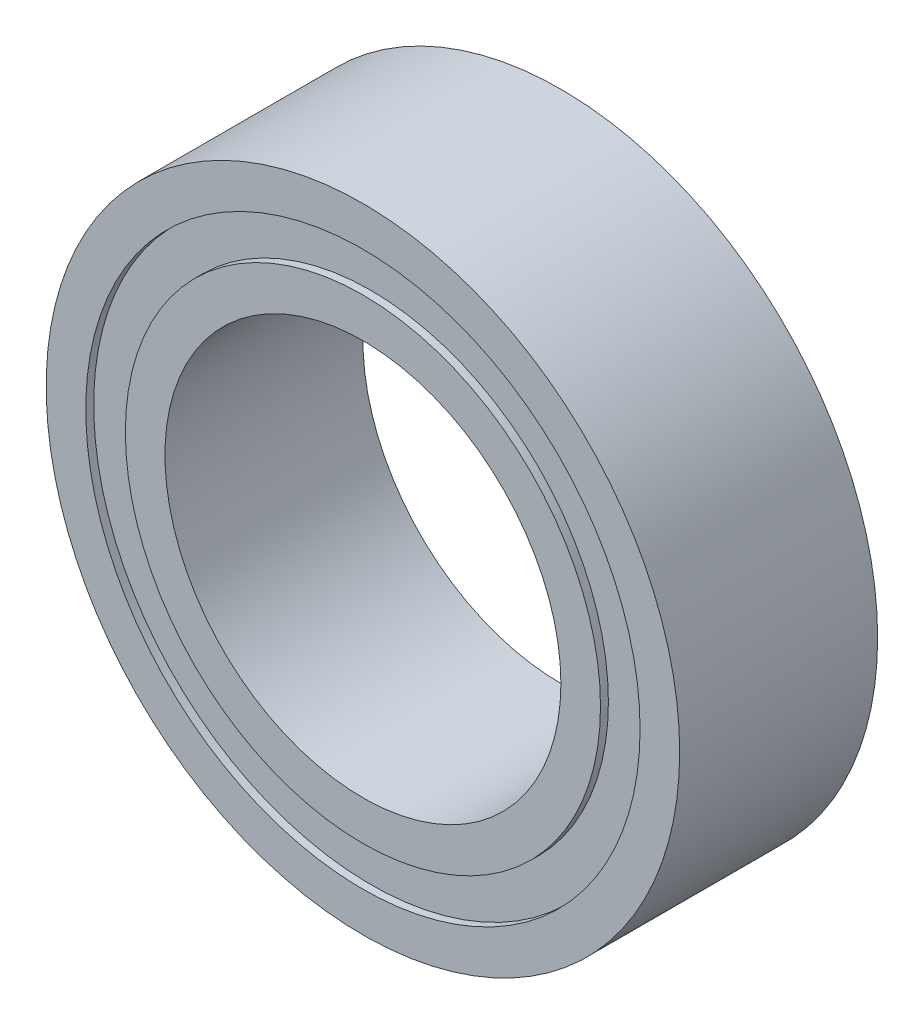
ISO-10303-21;
HEADER;
FILE_DESCRIPTION(('STEP AP214'),'2;1');
FILE_NAME('part.step','',(''),(''),'','','');
FILE_SCHEMA(('AUTOMOTIVE_DESIGN { 1 0 10303 214 1 1 1 1 }'));
ENDSEC;
DATA;
#1=APPLICATION_CONTEXT('core data for automotive mechanical design processes');
#2=APPLICATION_PROTOCOL_DEFINITION('international standard','automotive_design',2000,#1);
#3=PRODUCT_CONTEXT('',#1,'mechanical');
#4=PRODUCT('Part','Part','',(#3));
#5=PRODUCT_RELATED_PRODUCT_CATEGORY('part','',(#4));
#6=PRODUCT_DEFINITION_FORMATION('','',#4);
#7=PRODUCT_DEFINITION_CONTEXT('part definition',#1,'design');
#8=PRODUCT_DEFINITION('design','',#6,#7);
#9=PRODUCT_DEFINITION_SHAPE('','',#8);
#10=(LENGTH_UNIT() NAMED_UNIT(*) SI_UNIT(.MILLI.,.METRE.));
#11=(NAMED_UNIT(*) PLANE_ANGLE_UNIT() SI_UNIT($,.RADIAN.));
#12=(NAMED_UNIT(*) SI_UNIT($,.STERADIAN.) SOLID_ANGLE_UNIT());
#13=UNCERTAINTY_MEASURE_WITH_UNIT(LENGTH_MEASURE(1.E-05),#10,'distance_accuracy_value','');
#14=(GEOMETRIC_REPRESENTATION_CONTEXT(3) GLOBAL_UNCERTAINTY_ASSIGNED_CONTEXT((#13)) GLOBAL_UNIT_ASSIGNED_CONTEXT((#10,
#11,#12)) REPRESENTATION_CONTEXT('',''));
#15=CARTESIAN_POINT('',(0.,0.,0.));
#16=DIRECTION('',(0.,0.,1.));
#17=DIRECTION('',(1.,0.,0.));
#18=AXIS2_PLACEMENT_3D('',#15,#16,#17);
#19=CARTESIAN_POINT('',(0.,0.,2.5));
#20=DIRECTION('',(0.,0.,1.));
#21=DIRECTION('',(1.,0.,0.));
#22=AXIS2_PLACEMENT_3D('',#19,#20,#21);
#23=PLANE('',#22);
#24=CARTESIAN_POINT('',(0.,0.,2.5));
#25=DIRECTION('',(0.,0.,1.));
#26=DIRECTION('',(1.,0.,0.));
#27=AXIS2_PLACEMENT_3D('',#24,#25,#26);
#28=CIRCLE('',#27,2.5);
#29=CARTESIAN_POINT('',(2.5,0.,2.5));
#30=VERTEX_POINT('',#29);
#31=EDGE_CURVE('E48',#30,#30,#28,.T.);
#32=ORIENTED_EDGE('',*,*,#31,.F.);
#33=EDGE_LOOP('',(#32));
#34=FACE_BOUND('',#33,.T.);
#35=CARTESIAN_POINT('',(0.,0.,2.5));
#36=DIRECTION('',(0.,0.,1.));
#37=DIRECTION('',(1.,0.,0.));
#38=AXIS2_PLACEMENT_3D('',#35,#36,#37);
#39=CIRCLE('',#38,3.);
#40=CARTESIAN_POINT('',(3.,0.,2.5));
#41=VERTEX_POINT('',#40);
#42=EDGE_CURVE('E74',#41,#41,#39,.T.);
#43=ORIENTED_EDGE('',*,*,#42,.T.);
#44=EDGE_LOOP('',(#43));
#45=FACE_BOUND('',#44,.T.);
#46=ADVANCED_FACE('F37',(#34,#45),#23,.T.);
#47=CARTESIAN_POINT('',(0.,0.,0.));
#48=DIRECTION('',(0.,0.,1.));
#49=DIRECTION('',(1.,0.,0.));
#50=AXIS2_PLACEMENT_3D('',#47,#48,#49);
#51=PLANE('',#50);
#52=CARTESIAN_POINT('',(0.,0.,0.));
#53=DIRECTION('',(0.,0.,1.));
#54=DIRECTION('',(1.,0.,0.));
#55=AXIS2_PLACEMENT_3D('',#52,#53,#54);
#56=CIRCLE('',#55,2.5);
#57=CARTESIAN_POINT('',(2.5,0.,0.));
#58=VERTEX_POINT('',#57);
#59=EDGE_CURVE('E50',#58,#58,#56,.T.);
#60=ORIENTED_EDGE('',*,*,#59,.T.);
#61=EDGE_LOOP('',(#60));
#62=FACE_BOUND('',#61,.T.);
#63=CARTESIAN_POINT('',(0.,0.,0.));
#64=DIRECTION('',(0.,0.,-1.));
#65=DIRECTION('',(-1.,0.,0.));
#66=AXIS2_PLACEMENT_3D('',#63,#64,#65);
#67=CIRCLE('',#66,3.);
#68=CARTESIAN_POINT('',(-3.,0.,0.));
#69=VERTEX_POINT('',#68);
#70=EDGE_CURVE('E62',#69,#69,#67,.T.);
#71=ORIENTED_EDGE('',*,*,#70,.T.);
#72=EDGE_LOOP('',(#71));
#73=FACE_BOUND('',#72,.T.);
#74=ADVANCED_FACE('F99',(#62,#73),#51,.F.);
#75=CARTESIAN_POINT('',(0.,0.,2.5));
#76=DIRECTION('',(0.,0.,1.));
#77=DIRECTION('',(1.,0.,0.));
#78=AXIS2_PLACEMENT_3D('',#75,#76,#77);
#79=CIRCLE('',#78,3.5);
#80=CARTESIAN_POINT('',(3.5,0.,2.5));
#81=VERTEX_POINT('',#80);
#82=EDGE_CURVE('E68',#81,#81,#79,.T.);
#83=ORIENTED_EDGE('',*,*,#82,.F.);
#84=EDGE_LOOP('',(#83));
#85=FACE_BOUND('',#84,.T.);
#86=CARTESIAN_POINT('',(0.,0.,2.5));
#87=DIRECTION('',(0.,0.,1.));
#88=DIRECTION('',(1.,0.,0.));
#89=AXIS2_PLACEMENT_3D('',#86,#87,#88);
#90=CIRCLE('',#89,4.);
#91=CARTESIAN_POINT('',(4.,0.,2.5));
#92=VERTEX_POINT('',#91);
#93=EDGE_CURVE('E10',#92,#92,#90,.T.);
#94=ORIENTED_EDGE('',*,*,#93,.T.);
#95=EDGE_LOOP('',(#94));
#96=FACE_BOUND('',#95,.T.);
#97=ADVANCED_FACE('F96',(#85,#96),#23,.T.);
#98=CARTESIAN_POINT('',(0.,0.,0.));
#99=DIRECTION('',(0.,0.,-1.));
#100=DIRECTION('',(-1.,0.,0.));
#101=AXIS2_PLACEMENT_3D('',#98,#99,#100);
#102=CIRCLE('',#101,3.5);
#103=CARTESIAN_POINT('',(-3.5,0.,0.));
#104=VERTEX_POINT('',#103);
#105=EDGE_CURVE('E56',#104,#104,#102,.T.);
#106=ORIENTED_EDGE('',*,*,#105,.F.);
#107=EDGE_LOOP('',(#106));
#108=FACE_BOUND('',#107,.T.);
#109=CARTESIAN_POINT('',(0.,0.,0.));
#110=DIRECTION('',(0.,0.,1.));
#111=DIRECTION('',(1.,0.,0.));
#112=AXIS2_PLACEMENT_3D('',#109,#110,#111);
#113=CIRCLE('',#112,4.);
#114=CARTESIAN_POINT('',(4.,0.,0.));
#115=VERTEX_POINT('',#114);
#116=EDGE_CURVE('E41',#115,#115,#113,.T.);
#117=ORIENTED_EDGE('',*,*,#116,.F.);
#118=EDGE_LOOP('',(#117));
#119=FACE_BOUND('',#118,.T.);
#120=ADVANCED_FACE('F98',(#108,#119),#51,.F.);
#121=CARTESIAN_POINT('',(0.,0.,2.5));
#122=DIRECTION('',(0.,0.,-1.));
#123=DIRECTION('',(-1.,0.,0.));
#124=AXIS2_PLACEMENT_3D('',#121,#122,#123);
#125=CYLINDRICAL_SURFACE('',#124,4.);
#126=ORIENTED_EDGE('',*,*,#93,.F.);
#127=EDGE_LOOP('',(#126));
#128=FACE_BOUND('',#127,.T.);
#129=ORIENTED_EDGE('',*,*,#116,.T.);
#130=EDGE_LOOP('',(#129));
#131=FACE_BOUND('',#130,.T.);
#132=ADVANCED_FACE('F39',(#128,#131),#125,.T.);
#133=CARTESIAN_POINT('',(0.,0.,2.5));
#134=DIRECTION('',(0.,0.,-1.));
#135=DIRECTION('',(-1.,0.,0.));
#136=AXIS2_PLACEMENT_3D('',#133,#134,#135);
#137=CYLINDRICAL_SURFACE('',#136,2.5);
#138=ORIENTED_EDGE('',*,*,#31,.T.);
#139=EDGE_LOOP('',(#138));
#140=FACE_BOUND('',#139,.T.);
#141=ORIENTED_EDGE('',*,*,#59,.F.);
#142=EDGE_LOOP('',(#141));
#143=FACE_BOUND('',#142,.T.);
#144=ADVANCED_FACE('F129',(#140,#143),#137,.F.);
#145=CARTESIAN_POINT('',(0.,0.,0.1));
#146=DIRECTION('',(0.,0.,-1.));
#147=DIRECTION('',(-1.,0.,0.));
#148=AXIS2_PLACEMENT_3D('',#145,#146,#147);
#149=CYLINDRICAL_SURFACE('',#148,3.5);
#150=CARTESIAN_POINT('',(0.,0.,0.1));
#151=DIRECTION('',(0.,0.,-1.));
#152=DIRECTION('',(-1.,0.,0.));
#153=AXIS2_PLACEMENT_3D('',#150,#151,#152);
#154=CIRCLE('',#153,3.5);
#155=CARTESIAN_POINT('',(-3.5,0.,0.1));
#156=VERTEX_POINT('',#155);
#157=EDGE_CURVE('E53',#156,#156,#154,.T.);
#158=ORIENTED_EDGE('',*,*,#157,.F.);
#159=EDGE_LOOP('',(#158));
#160=FACE_BOUND('',#159,.T.);
#161=ORIENTED_EDGE('',*,*,#105,.T.);
#162=EDGE_LOOP('',(#161));
#163=FACE_BOUND('',#162,.T.);
#164=ADVANCED_FACE('F126',(#160,#163),#149,.F.);
#165=CARTESIAN_POINT('',(0.,0.,0.1));
#166=DIRECTION('',(0.,0.,-1.));
#167=DIRECTION('',(-1.,0.,0.));
#168=AXIS2_PLACEMENT_3D('',#165,#166,#167);
#169=PLANE('',#168);
#170=CARTESIAN_POINT('',(0.,0.,0.1));
#171=DIRECTION('',(0.,0.,-1.));
#172=DIRECTION('',(-1.,0.,0.));
#173=AXIS2_PLACEMENT_3D('',#170,#171,#172);
#174=CIRCLE('',#173,3.);
#175=CARTESIAN_POINT('',(-3.,0.,0.1));
#176=VERTEX_POINT('',#175);
#177=EDGE_CURVE('E59',#176,#176,#174,.T.);
#178=ORIENTED_EDGE('',*,*,#177,.F.);
#179=EDGE_LOOP('',(#178));
#180=FACE_BOUND('',#179,.T.);
#181=ORIENTED_EDGE('',*,*,#157,.T.);
#182=EDGE_LOOP('',(#181));
#183=FACE_BOUND('',#182,.T.);
#184=ADVANCED_FACE('F122',(#180,#183),#169,.T.);
#185=CARTESIAN_POINT('',(0.,0.,0.1));
#186=DIRECTION('',(0.,0.,-1.));
#187=DIRECTION('',(-1.,0.,0.));
#188=AXIS2_PLACEMENT_3D('',#185,#186,#187);
#189=CYLINDRICAL_SURFACE('',#188,3.);
#190=ORIENTED_EDGE('',*,*,#177,.T.);
#191=EDGE_LOOP('',(#190));
#192=FACE_BOUND('',#191,.T.);
#193=ORIENTED_EDGE('',*,*,#70,.F.);
#194=EDGE_LOOP('',(#193));
#195=FACE_BOUND('',#194,.T.);
#196=ADVANCED_FACE('F92',(#192,#195),#189,.T.);
#197=CARTESIAN_POINT('',(0.,0.,2.4));
#198=DIRECTION('',(0.,0.,1.));
#199=DIRECTION('',(1.,0.,0.));
#200=AXIS2_PLACEMENT_3D('',#197,#198,#199);
#201=CYLINDRICAL_SURFACE('',#200,3.5);
#202=CARTESIAN_POINT('',(0.,0.,2.4));
#203=DIRECTION('',(0.,0.,1.));
#204=DIRECTION('',(1.,0.,0.));
#205=AXIS2_PLACEMENT_3D('',#202,#203,#204);
#206=CIRCLE('',#205,3.5);
#207=CARTESIAN_POINT('',(3.5,0.,2.4));
#208=VERTEX_POINT('',#207);
#209=EDGE_CURVE('E65',#208,#208,#206,.T.);
#210=ORIENTED_EDGE('',*,*,#209,.F.);
#211=EDGE_LOOP('',(#210));
#212=FACE_BOUND('',#211,.T.);
#213=ORIENTED_EDGE('',*,*,#82,.T.);
#214=EDGE_LOOP('',(#213));
#215=FACE_BOUND('',#214,.T.);
#216=ADVANCED_FACE('F86',(#212,#215),#201,.F.);
#217=CARTESIAN_POINT('',(0.,0.,2.4));
#218=DIRECTION('',(0.,0.,1.));
#219=DIRECTION('',(1.,0.,0.));
#220=AXIS2_PLACEMENT_3D('',#217,#218,#219);
#221=PLANE('',#220);
#222=CARTESIAN_POINT('',(0.,0.,2.4));
#223=DIRECTION('',(0.,0.,1.));
#224=DIRECTION('',(1.,0.,0.));
#225=AXIS2_PLACEMENT_3D('',#222,#223,#224);
#226=CIRCLE('',#225,3.);
#227=CARTESIAN_POINT('',(3.,0.,2.4));
#228=VERTEX_POINT('',#227);
#229=EDGE_CURVE('E71',#228,#228,#226,.T.);
#230=ORIENTED_EDGE('',*,*,#229,.F.);
#231=EDGE_LOOP('',(#230));
#232=FACE_BOUND('',#231,.T.);
#233=ORIENTED_EDGE('',*,*,#209,.T.);
#234=EDGE_LOOP('',(#233));
#235=FACE_BOUND('',#234,.T.);
#236=ADVANCED_FACE('F83',(#232,#235),#221,.T.);
#237=CARTESIAN_POINT('',(0.,0.,2.4));
#238=DIRECTION('',(0.,0.,1.));
#239=DIRECTION('',(1.,0.,0.));
#240=AXIS2_PLACEMENT_3D('',#237,#238,#239);
#241=CYLINDRICAL_SURFACE('',#240,3.);
#242=ORIENTED_EDGE('',*,*,#229,.T.);
#243=EDGE_LOOP('',(#242));
#244=FACE_BOUND('',#243,.T.);
#245=ORIENTED_EDGE('',*,*,#42,.F.);
#246=EDGE_LOOP('',(#245));
#247=FACE_BOUND('',#246,.T.);
#248=ADVANCED_FACE('F80',(#244,#247),#241,.T.);
#249=CLOSED_SHELL('',(#46,#74,#97,#120,#132,#144,#164,#184,#196,#216,#236,#248));
#250=MANIFOLD_SOLID_BREP('B2',#249);
#251=ADVANCED_BREP_SHAPE_REPRESENTATION('',(#18,#250),#14);
#252=SHAPE_DEFINITION_REPRESENTATION(#9,#251);
ENDSEC;
END-ISO-10303-21;
